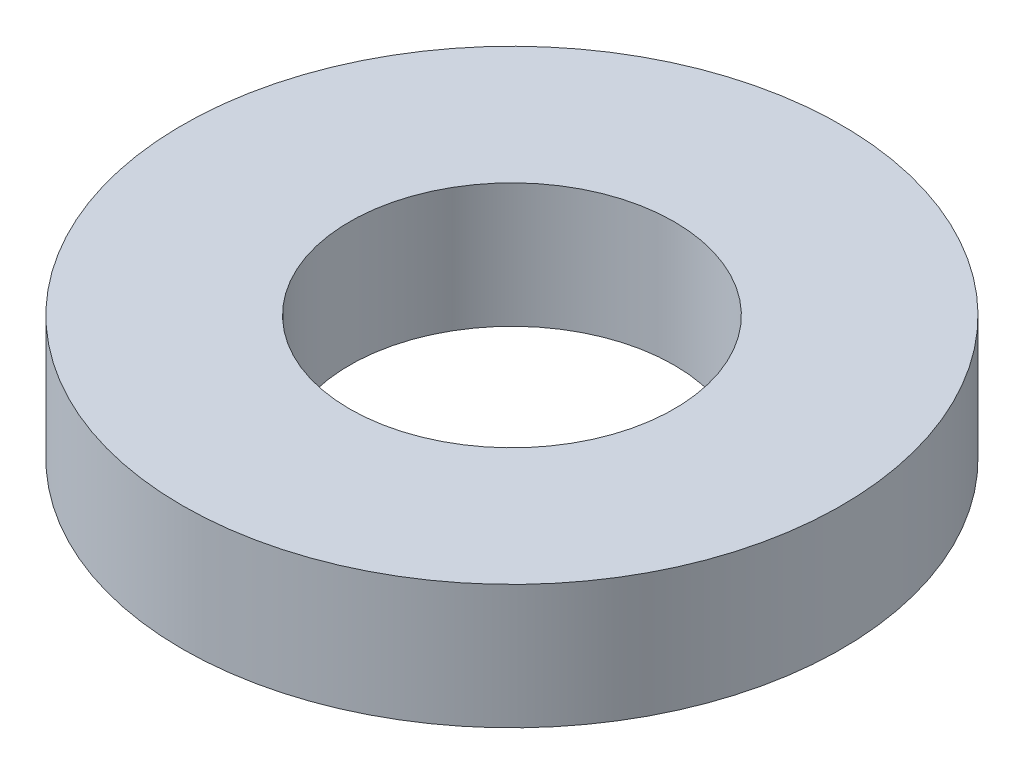
ISO-10303-21;
HEADER;
FILE_DESCRIPTION(('STEP AP214'),'2;1');
FILE_NAME('part.step','',(''),(''),'','','');
FILE_SCHEMA(('AUTOMOTIVE_DESIGN { 1 0 10303 214 1 1 1 1 }'));
ENDSEC;
DATA;
#1=APPLICATION_CONTEXT('core data for automotive mechanical design processes');
#2=APPLICATION_PROTOCOL_DEFINITION('international standard','automotive_design',2000,#1);
#3=PRODUCT_CONTEXT('',#1,'mechanical');
#4=PRODUCT('Part','Part','',(#3));
#5=PRODUCT_RELATED_PRODUCT_CATEGORY('part','',(#4));
#6=PRODUCT_DEFINITION_FORMATION('','',#4);
#7=PRODUCT_DEFINITION_CONTEXT('part definition',#1,'design');
#8=PRODUCT_DEFINITION('design','',#6,#7);
#9=PRODUCT_DEFINITION_SHAPE('','',#8);
#10=(LENGTH_UNIT() NAMED_UNIT(*) SI_UNIT(.MILLI.,.METRE.));
#11=(NAMED_UNIT(*) PLANE_ANGLE_UNIT() SI_UNIT($,.RADIAN.));
#12=(NAMED_UNIT(*) SI_UNIT($,.STERADIAN.) SOLID_ANGLE_UNIT());
#13=UNCERTAINTY_MEASURE_WITH_UNIT(LENGTH_MEASURE(1.E-05),#10,'distance_accuracy_value','');
#14=(GEOMETRIC_REPRESENTATION_CONTEXT(3) GLOBAL_UNCERTAINTY_ASSIGNED_CONTEXT((#13)) GLOBAL_UNIT_ASSIGNED_CONTEXT((#10,
#11,#12)) REPRESENTATION_CONTEXT('',''));
#15=CARTESIAN_POINT('',(0.,0.,0.));
#16=DIRECTION('',(0.,0.,1.));
#17=DIRECTION('',(1.,0.,0.));
#18=AXIS2_PLACEMENT_3D('',#15,#16,#17);
#19=CARTESIAN_POINT('',(476.510652388512,-51.0645033639548,-642.980431195112));
#20=DIRECTION('',(0.,1.,0.));
#21=DIRECTION('',(0.,0.,1.));
#22=AXIS2_PLACEMENT_3D('',#19,#20,#21);
#23=PLANE('',#22);
#24=CARTESIAN_POINT('',(502.510652388511,-51.0645033639548,-415.480431195113));
#25=DIRECTION('',(0.,1.,0.));
#26=DIRECTION('',(0.,0.,1.));
#27=AXIS2_PLACEMENT_3D('',#24,#25,#26);
#28=CIRCLE('',#27,3.2);
#29=CARTESIAN_POINT('',(502.510652388511,-51.0645033639548,-412.280431195113));
#30=VERTEX_POINT('',#29);
#31=EDGE_CURVE('E27',#30,#30,#28,.T.);
#32=ORIENTED_EDGE('',*,*,#31,.T.);
#33=EDGE_LOOP('',(#32));
#34=FACE_BOUND('',#33,.T.);
#35=CARTESIAN_POINT('',(502.510652388511,-51.0645033639548,-415.480431195113));
#36=DIRECTION('',(0.,1.,0.));
#37=DIRECTION('',(0.,0.,1.));
#38=AXIS2_PLACEMENT_3D('',#35,#36,#37);
#39=CIRCLE('',#38,6.5);
#40=CARTESIAN_POINT('',(502.510652388511,-51.0645033639548,-408.980431195113));
#41=VERTEX_POINT('',#40);
#42=EDGE_CURVE('E18',#41,#41,#39,.T.);
#43=ORIENTED_EDGE('',*,*,#42,.F.);
#44=EDGE_LOOP('',(#43));
#45=FACE_BOUND('',#44,.T.);
#46=ADVANCED_FACE('F15',(#34,#45),#23,.F.);
#47=CARTESIAN_POINT('',(502.510652388511,-51.0645033639548,-415.480431195113));
#48=DIRECTION('',(0.,1.,0.));
#49=DIRECTION('',(0.,0.,1.));
#50=AXIS2_PLACEMENT_3D('',#47,#48,#49);
#51=CYLINDRICAL_SURFACE('',#50,6.5);
#52=ORIENTED_EDGE('',*,*,#42,.T.);
#53=EDGE_LOOP('',(#52));
#54=FACE_BOUND('',#53,.T.);
#55=CARTESIAN_POINT('',(502.510652388511,-48.6145033639548,-415.480431195113));
#56=DIRECTION('',(0.,1.,0.));
#57=DIRECTION('',(0.,0.,1.));
#58=AXIS2_PLACEMENT_3D('',#55,#56,#57);
#59=CIRCLE('',#58,6.5);
#60=CARTESIAN_POINT('',(502.510652388511,-48.6145033639548,-408.980431195113));
#61=VERTEX_POINT('',#60);
#62=EDGE_CURVE('E22',#61,#61,#59,.T.);
#63=ORIENTED_EDGE('',*,*,#62,.F.);
#64=EDGE_LOOP('',(#63));
#65=FACE_BOUND('',#64,.T.);
#66=ADVANCED_FACE('F35',(#54,#65),#51,.T.);
#67=CARTESIAN_POINT('',(502.510652388511,-51.0645033639548,-415.480431195113));
#68=DIRECTION('',(0.,1.,0.));
#69=DIRECTION('',(0.,0.,1.));
#70=AXIS2_PLACEMENT_3D('',#67,#68,#69);
#71=CYLINDRICAL_SURFACE('',#70,3.2);
#72=CARTESIAN_POINT('',(502.510652388511,-48.6145033639548,-415.480431195113));
#73=DIRECTION('',(0.,1.,0.));
#74=DIRECTION('',(0.,0.,1.));
#75=AXIS2_PLACEMENT_3D('',#72,#73,#74);
#76=CIRCLE('',#75,3.2);
#77=CARTESIAN_POINT('',(502.510652388511,-48.6145033639548,-412.280431195113));
#78=VERTEX_POINT('',#77);
#79=EDGE_CURVE('E10',#78,#78,#76,.F.);
#80=ORIENTED_EDGE('',*,*,#79,.F.);
#81=EDGE_LOOP('',(#80));
#82=FACE_BOUND('',#81,.T.);
#83=ORIENTED_EDGE('',*,*,#31,.F.);
#84=EDGE_LOOP('',(#83));
#85=FACE_BOUND('',#84,.T.);
#86=ADVANCED_FACE('F43',(#82,#85),#71,.F.);
#87=CARTESIAN_POINT('',(476.510652388512,-48.6145033639548,-642.980431195112));
#88=DIRECTION('',(0.,1.,0.));
#89=DIRECTION('',(0.,0.,1.));
#90=AXIS2_PLACEMENT_3D('',#87,#88,#89);
#91=PLANE('',#90);
#92=ORIENTED_EDGE('',*,*,#79,.T.);
#93=EDGE_LOOP('',(#92));
#94=FACE_BOUND('',#93,.T.);
#95=ORIENTED_EDGE('',*,*,#62,.T.);
#96=EDGE_LOOP('',(#95));
#97=FACE_BOUND('',#96,.T.);
#98=ADVANCED_FACE('F44',(#94,#97),#91,.T.);
#99=CLOSED_SHELL('',(#46,#66,#86,#98));
#100=MANIFOLD_SOLID_BREP('B1',#99);
#101=ADVANCED_BREP_SHAPE_REPRESENTATION('',(#18,#100),#14);
#102=SHAPE_DEFINITION_REPRESENTATION(#9,#101);
ENDSEC;
END-ISO-10303-21;
